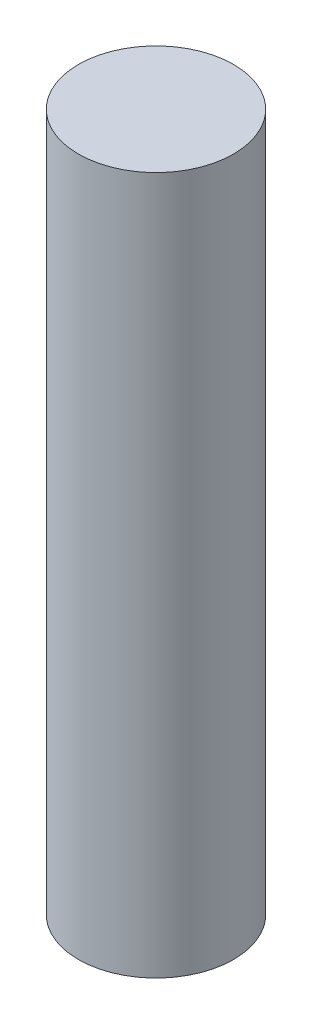
ISO-10303-21;
HEADER;
FILE_DESCRIPTION(('STEP AP214'),'2;1');
FILE_NAME('part.step','',(''),(''),'','','');
FILE_SCHEMA(('AUTOMOTIVE_DESIGN { 1 0 10303 214 1 1 1 1 }'));
ENDSEC;
DATA;
#1=APPLICATION_CONTEXT('core data for automotive mechanical design processes');
#2=APPLICATION_PROTOCOL_DEFINITION('international standard','automotive_design',2000,#1);
#3=PRODUCT_CONTEXT('',#1,'mechanical');
#4=PRODUCT('Part','Part','',(#3));
#5=PRODUCT_RELATED_PRODUCT_CATEGORY('part','',(#4));
#6=PRODUCT_DEFINITION_FORMATION('','',#4);
#7=PRODUCT_DEFINITION_CONTEXT('part definition',#1,'design');
#8=PRODUCT_DEFINITION('design','',#6,#7);
#9=PRODUCT_DEFINITION_SHAPE('','',#8);
#10=(LENGTH_UNIT() NAMED_UNIT(*) SI_UNIT(.MILLI.,.METRE.));
#11=(NAMED_UNIT(*) PLANE_ANGLE_UNIT() SI_UNIT($,.RADIAN.));
#12=(NAMED_UNIT(*) SI_UNIT($,.STERADIAN.) SOLID_ANGLE_UNIT());
#13=UNCERTAINTY_MEASURE_WITH_UNIT(LENGTH_MEASURE(1.E-05),#10,'distance_accuracy_value','');
#14=(GEOMETRIC_REPRESENTATION_CONTEXT(3) GLOBAL_UNCERTAINTY_ASSIGNED_CONTEXT((#13)) GLOBAL_UNIT_ASSIGNED_CONTEXT((#10,
#11,#12)) REPRESENTATION_CONTEXT('',''));
#15=CARTESIAN_POINT('',(0.,0.,0.));
#16=DIRECTION('',(0.,0.,1.));
#17=DIRECTION('',(1.,0.,0.));
#18=AXIS2_PLACEMENT_3D('',#15,#16,#17);
#19=CARTESIAN_POINT('',(0.,40.,0.));
#20=DIRECTION('',(0.,-1.,0.));
#21=DIRECTION('',(0.,0.,-1.));
#22=AXIS2_PLACEMENT_3D('',#19,#20,#21);
#23=CYLINDRICAL_SURFACE('',#22,4.45);
#24=CARTESIAN_POINT('',(0.,40.,0.));
#25=DIRECTION('',(0.,1.,0.));
#26=DIRECTION('',(0.,0.,1.));
#27=AXIS2_PLACEMENT_3D('',#24,#25,#26);
#28=CIRCLE('',#27,4.45);
#29=CARTESIAN_POINT('',(0.,40.,4.45));
#30=VERTEX_POINT('',#29);
#31=EDGE_CURVE('E10',#30,#30,#28,.T.);
#32=ORIENTED_EDGE('',*,*,#31,.F.);
#33=EDGE_LOOP('',(#32));
#34=FACE_BOUND('',#33,.T.);
#35=CARTESIAN_POINT('',(0.,0.,0.));
#36=DIRECTION('',(0.,1.,0.));
#37=DIRECTION('',(0.,0.,1.));
#38=AXIS2_PLACEMENT_3D('',#35,#36,#37);
#39=CIRCLE('',#38,4.45);
#40=CARTESIAN_POINT('',(0.,0.,4.45));
#41=VERTEX_POINT('',#40);
#42=EDGE_CURVE('E42',#41,#41,#39,.T.);
#43=ORIENTED_EDGE('',*,*,#42,.T.);
#44=EDGE_LOOP('',(#43));
#45=FACE_BOUND('',#44,.T.);
#46=ADVANCED_FACE('F39',(#34,#45),#23,.T.);
#47=CARTESIAN_POINT('',(0.,40.,0.));
#48=DIRECTION('',(0.,1.,0.));
#49=DIRECTION('',(0.,0.,1.));
#50=AXIS2_PLACEMENT_3D('',#47,#48,#49);
#51=PLANE('',#50);
#52=ORIENTED_EDGE('',*,*,#31,.T.);
#53=EDGE_LOOP('',(#52));
#54=FACE_BOUND('',#53,.T.);
#55=ADVANCED_FACE('F54',(#54),#51,.T.);
#56=CARTESIAN_POINT('',(0.,0.,0.));
#57=DIRECTION('',(0.,1.,0.));
#58=DIRECTION('',(0.,0.,1.));
#59=AXIS2_PLACEMENT_3D('',#56,#57,#58);
#60=PLANE('',#59);
#61=ORIENTED_EDGE('',*,*,#42,.F.);
#62=EDGE_LOOP('',(#61));
#63=FACE_BOUND('',#62,.T.);
#64=ADVANCED_FACE('F52',(#63),#60,.F.);
#65=CLOSED_SHELL('',(#46,#55,#64));
#66=MANIFOLD_SOLID_BREP('B2',#65);
#67=ADVANCED_BREP_SHAPE_REPRESENTATION('',(#18,#66),#14);
#68=SHAPE_DEFINITION_REPRESENTATION(#9,#67);
ENDSEC;
END-ISO-10303-21;
